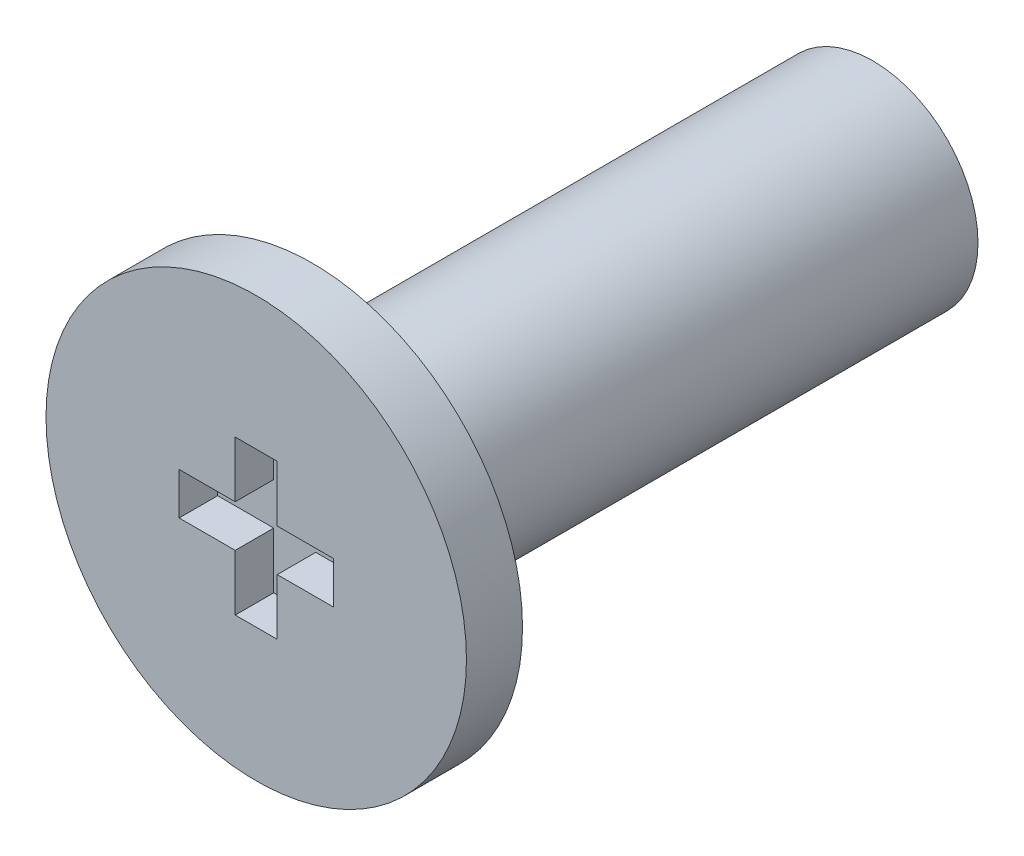
ISO-10303-21;
HEADER;
FILE_DESCRIPTION(('STEP AP214'),'2;1');
FILE_NAME('part.step','',(''),(''),'','','');
FILE_SCHEMA(('AUTOMOTIVE_DESIGN { 1 0 10303 214 1 1 1 1 }'));
ENDSEC;
DATA;
#1=APPLICATION_CONTEXT('core data for automotive mechanical design processes');
#2=APPLICATION_PROTOCOL_DEFINITION('international standard','automotive_design',2000,#1);
#3=PRODUCT_CONTEXT('',#1,'mechanical');
#4=PRODUCT('Part','Part','',(#3));
#5=PRODUCT_RELATED_PRODUCT_CATEGORY('part','',(#4));
#6=PRODUCT_DEFINITION_FORMATION('','',#4);
#7=PRODUCT_DEFINITION_CONTEXT('part definition',#1,'design');
#8=PRODUCT_DEFINITION('design','',#6,#7);
#9=PRODUCT_DEFINITION_SHAPE('','',#8);
#10=(LENGTH_UNIT() NAMED_UNIT(*) SI_UNIT(.MILLI.,.METRE.));
#11=(NAMED_UNIT(*) PLANE_ANGLE_UNIT() SI_UNIT($,.RADIAN.));
#12=(NAMED_UNIT(*) SI_UNIT($,.STERADIAN.) SOLID_ANGLE_UNIT());
#13=UNCERTAINTY_MEASURE_WITH_UNIT(LENGTH_MEASURE(1.E-05),#10,'distance_accuracy_value','');
#14=(GEOMETRIC_REPRESENTATION_CONTEXT(3) GLOBAL_UNCERTAINTY_ASSIGNED_CONTEXT((#13)) GLOBAL_UNIT_ASSIGNED_CONTEXT((#10,
#11,#12)) REPRESENTATION_CONTEXT('',''));
#15=CARTESIAN_POINT('',(0.,0.,0.));
#16=DIRECTION('',(0.,0.,1.));
#17=DIRECTION('',(1.,0.,0.));
#18=AXIS2_PLACEMENT_3D('',#15,#16,#17);
#19=CARTESIAN_POINT('',(0.,0.,-8.));
#20=DIRECTION('',(0.,0.,1.));
#21=DIRECTION('',(1.,0.,0.));
#22=AXIS2_PLACEMENT_3D('',#19,#20,#21);
#23=CYLINDRICAL_SURFACE('',#22,1.5);
#24=CARTESIAN_POINT('',(0.,0.,-8.));
#25=DIRECTION('',(0.,0.,1.));
#26=DIRECTION('',(1.,0.,0.));
#27=AXIS2_PLACEMENT_3D('',#24,#25,#26);
#28=CIRCLE('',#27,1.5);
#29=CARTESIAN_POINT('',(1.5,0.,-8.));
#30=VERTEX_POINT('',#29);
#31=EDGE_CURVE('E212',#30,#30,#28,.T.);
#32=ORIENTED_EDGE('',*,*,#31,.T.);
#33=EDGE_LOOP('',(#32));
#34=FACE_BOUND('',#33,.T.);
#35=CARTESIAN_POINT('',(0.,0.,0.));
#36=DIRECTION('',(0.,0.,1.));
#37=DIRECTION('',(1.,0.,0.));
#38=AXIS2_PLACEMENT_3D('',#35,#36,#37);
#39=CIRCLE('',#38,1.5);
#40=CARTESIAN_POINT('',(1.5,0.,0.));
#41=VERTEX_POINT('',#40);
#42=EDGE_CURVE('E208',#41,#41,#39,.T.);
#43=ORIENTED_EDGE('',*,*,#42,.F.);
#44=EDGE_LOOP('',(#43));
#45=FACE_BOUND('',#44,.T.);
#46=ADVANCED_FACE('F41',(#34,#45),#23,.T.);
#47=CARTESIAN_POINT('',(0.,0.,-8.));
#48=DIRECTION('',(0.,0.,1.));
#49=DIRECTION('',(1.,0.,0.));
#50=AXIS2_PLACEMENT_3D('',#47,#48,#49);
#51=PLANE('',#50);
#52=ORIENTED_EDGE('',*,*,#31,.F.);
#53=EDGE_LOOP('',(#52));
#54=FACE_BOUND('',#53,.T.);
#55=ADVANCED_FACE('F281',(#54),#51,.F.);
#56=CARTESIAN_POINT('',(0.,0.,0.));
#57=DIRECTION('',(0.,0.,1.));
#58=DIRECTION('',(1.,0.,0.));
#59=AXIS2_PLACEMENT_3D('',#56,#57,#58);
#60=PLANE('',#59);
#61=ORIENTED_EDGE('',*,*,#42,.T.);
#62=EDGE_LOOP('',(#61));
#63=FACE_BOUND('',#62,.T.);
#64=CARTESIAN_POINT('',(0.,0.,0.));
#65=DIRECTION('',(0.,0.,-1.));
#66=DIRECTION('',(-1.,0.,0.));
#67=AXIS2_PLACEMENT_3D('',#64,#65,#66);
#68=CIRCLE('',#67,3.);
#69=CARTESIAN_POINT('',(-3.,0.,0.));
#70=VERTEX_POINT('',#69);
#71=EDGE_CURVE('E210',#70,#70,#68,.T.);
#72=ORIENTED_EDGE('',*,*,#71,.T.);
#73=EDGE_LOOP('',(#72));
#74=FACE_BOUND('',#73,.T.);
#75=ADVANCED_FACE('F286',(#63,#74),#60,.F.);
#76=CARTESIAN_POINT('',(0.,0.,-2.));
#77=DIRECTION('',(0.,0.,-1.));
#78=DIRECTION('',(-1.,0.,0.));
#79=AXIS2_PLACEMENT_3D('',#76,#77,#78);
#80=CYLINDRICAL_SURFACE('',#79,3.);
#81=ORIENTED_EDGE('',*,*,#71,.F.);
#82=EDGE_LOOP('',(#81));
#83=FACE_BOUND('',#82,.T.);
#84=CARTESIAN_POINT('',(0.,0.,0.8));
#85=DIRECTION('',(0.,0.,-1.));
#86=DIRECTION('',(-1.,0.,0.));
#87=AXIS2_PLACEMENT_3D('',#84,#85,#86);
#88=CIRCLE('',#87,3.);
#89=CARTESIAN_POINT('',(-3.,0.,0.8));
#90=VERTEX_POINT('',#89);
#91=EDGE_CURVE('E180',#90,#90,#88,.T.);
#92=ORIENTED_EDGE('',*,*,#91,.T.);
#93=EDGE_LOOP('',(#92));
#94=FACE_BOUND('',#93,.T.);
#95=ADVANCED_FACE('F300',(#83,#94),#80,.T.);
#96=CARTESIAN_POINT('',(3.,0.,0.8));
#97=DIRECTION('',(0.,0.,-1.));
#98=DIRECTION('',(-1.,0.,0.));
#99=AXIS2_PLACEMENT_3D('',#96,#97,#98);
#100=PLANE('',#99);
#101=DIRECTION('',(-1.,0.,0.));
#102=VECTOR('',#101,1.);
#103=CARTESIAN_POINT('',(3.,-1.1,0.8));
#104=LINE('',#103,#102);
#105=CARTESIAN_POINT('',(0.3,-1.1,0.8));
#106=VERTEX_POINT('',#105);
#107=CARTESIAN_POINT('',(-0.3,-1.1,0.8));
#108=VERTEX_POINT('',#107);
#109=EDGE_CURVE('E211',#106,#108,#104,.T.);
#110=ORIENTED_EDGE('',*,*,#109,.T.);
#111=DIRECTION('',(0.,1.,0.));
#112=VECTOR('',#111,1.);
#113=CARTESIAN_POINT('',(-0.3,0.,0.8));
#114=LINE('',#113,#112);
#115=CARTESIAN_POINT('',(-0.3,-0.3,0.8));
#116=VERTEX_POINT('',#115);
#117=EDGE_CURVE('E11',#108,#116,#114,.T.);
#118=ORIENTED_EDGE('',*,*,#117,.T.);
#119=DIRECTION('',(-1.,0.,0.));
#120=VECTOR('',#119,1.);
#121=CARTESIAN_POINT('',(3.,-0.3,0.8));
#122=LINE('',#121,#120);
#123=CARTESIAN_POINT('',(-1.1,-0.3,0.8));
#124=VERTEX_POINT('',#123);
#125=EDGE_CURVE('E48',#116,#124,#122,.T.);
#126=ORIENTED_EDGE('',*,*,#125,.T.);
#127=DIRECTION('',(0.,1.,0.));
#128=VECTOR('',#127,1.);
#129=CARTESIAN_POINT('',(-1.1,0.,0.8));
#130=LINE('',#129,#128);
#131=CARTESIAN_POINT('',(-1.1,0.3,0.8));
#132=VERTEX_POINT('',#131);
#133=EDGE_CURVE('E245',#124,#132,#130,.T.);
#134=ORIENTED_EDGE('',*,*,#133,.T.);
#135=DIRECTION('',(1.,0.,0.));
#136=VECTOR('',#135,1.);
#137=CARTESIAN_POINT('',(3.,0.3,0.8));
#138=LINE('',#137,#136);
#139=CARTESIAN_POINT('',(-0.3,0.3,0.8));
#140=VERTEX_POINT('',#139);
#141=EDGE_CURVE('E236',#132,#140,#138,.T.);
#142=ORIENTED_EDGE('',*,*,#141,.T.);
#143=DIRECTION('',(0.,1.,0.));
#144=VECTOR('',#143,1.);
#145=CARTESIAN_POINT('',(-0.3,0.,0.8));
#146=LINE('',#145,#144);
#147=CARTESIAN_POINT('',(-0.3,1.1,0.8));
#148=VERTEX_POINT('',#147);
#149=EDGE_CURVE('E237',#140,#148,#146,.T.);
#150=ORIENTED_EDGE('',*,*,#149,.T.);
#151=DIRECTION('',(1.,0.,0.));
#152=VECTOR('',#151,1.);
#153=CARTESIAN_POINT('',(3.,1.1,0.8));
#154=LINE('',#153,#152);
#155=CARTESIAN_POINT('',(0.3,1.1,0.8));
#156=VERTEX_POINT('',#155);
#157=EDGE_CURVE('E231',#148,#156,#154,.T.);
#158=ORIENTED_EDGE('',*,*,#157,.T.);
#159=DIRECTION('',(0.,-1.,0.));
#160=VECTOR('',#159,1.);
#161=CARTESIAN_POINT('',(0.3,0.,0.8));
#162=LINE('',#161,#160);
#163=CARTESIAN_POINT('',(0.3,0.3,0.8));
#164=VERTEX_POINT('',#163);
#165=EDGE_CURVE('E229',#156,#164,#162,.T.);
#166=ORIENTED_EDGE('',*,*,#165,.T.);
#167=DIRECTION('',(1.,0.,0.));
#168=VECTOR('',#167,1.);
#169=CARTESIAN_POINT('',(3.,0.3,0.8));
#170=LINE('',#169,#168);
#171=CARTESIAN_POINT('',(1.1,0.3,0.8));
#172=VERTEX_POINT('',#171);
#173=EDGE_CURVE('E230',#164,#172,#170,.T.);
#174=ORIENTED_EDGE('',*,*,#173,.T.);
#175=DIRECTION('',(0.,-1.,0.));
#176=VECTOR('',#175,1.);
#177=CARTESIAN_POINT('',(1.1,0.,0.8));
#178=LINE('',#177,#176);
#179=CARTESIAN_POINT('',(1.1,-0.3,0.8));
#180=VERTEX_POINT('',#179);
#181=EDGE_CURVE('E224',#172,#180,#178,.T.);
#182=ORIENTED_EDGE('',*,*,#181,.T.);
#183=DIRECTION('',(-1.,0.,0.));
#184=VECTOR('',#183,1.);
#185=CARTESIAN_POINT('',(3.,-0.3,0.8));
#186=LINE('',#185,#184);
#187=CARTESIAN_POINT('',(0.3,-0.3,0.8));
#188=VERTEX_POINT('',#187);
#189=EDGE_CURVE('E222',#180,#188,#186,.T.);
#190=ORIENTED_EDGE('',*,*,#189,.T.);
#191=DIRECTION('',(0.,-1.,0.));
#192=VECTOR('',#191,1.);
#193=CARTESIAN_POINT('',(0.3,0.,0.8));
#194=LINE('',#193,#192);
#195=EDGE_CURVE('E217',#188,#106,#194,.T.);
#196=ORIENTED_EDGE('',*,*,#195,.T.);
#197=EDGE_LOOP('',(#110,#118,#126,#134,#142,#150,#158,#166,#174,#182,#190,#196));
#198=FACE_BOUND('',#197,.T.);
#199=ORIENTED_EDGE('',*,*,#91,.F.);
#200=EDGE_LOOP('',(#199));
#201=FACE_BOUND('',#200,.T.);
#202=ADVANCED_FACE('F244',(#198,#201),#100,.F.);
#203=CARTESIAN_POINT('',(-0.3,-0.3,0.25));
#204=DIRECTION('',(-1.,0.,0.));
#205=DIRECTION('',(0.,0.,1.));
#206=AXIS2_PLACEMENT_3D('',#203,#204,#205);
#207=PLANE('',#206);
#208=DIRECTION('',(0.,0.,1.));
#209=VECTOR('',#208,1.);
#210=CARTESIAN_POINT('',(-0.3,-1.1,0.25));
#211=LINE('',#210,#209);
#212=CARTESIAN_POINT('',(-0.3,-1.1,0.25));
#213=VERTEX_POINT('',#212);
#214=EDGE_CURVE('E54',#213,#108,#211,.T.);
#215=ORIENTED_EDGE('',*,*,#214,.F.);
#216=DIRECTION('',(0.,-1.,0.));
#217=VECTOR('',#216,1.);
#218=CARTESIAN_POINT('',(-0.3,-0.3,0.25));
#219=LINE('',#218,#217);
#220=CARTESIAN_POINT('',(-0.3,-0.3,0.25));
#221=VERTEX_POINT('',#220);
#222=EDGE_CURVE('E129',#221,#213,#219,.T.);
#223=ORIENTED_EDGE('',*,*,#222,.F.);
#224=DIRECTION('',(0.,0.,1.));
#225=VECTOR('',#224,1.);
#226=CARTESIAN_POINT('',(-0.3,-0.3,0.25));
#227=LINE('',#226,#225);
#228=EDGE_CURVE('E171',#221,#116,#227,.T.);
#229=ORIENTED_EDGE('',*,*,#228,.T.);
#230=ORIENTED_EDGE('',*,*,#117,.F.);
#231=EDGE_LOOP('',(#215,#223,#229,#230));
#232=FACE_BOUND('',#231,.T.);
#233=ADVANCED_FACE('F127',(#232),#207,.F.);
#234=CARTESIAN_POINT('',(-1.1,-0.3,0.25));
#235=DIRECTION('',(0.,-1.,0.));
#236=DIRECTION('',(0.,0.,-1.));
#237=AXIS2_PLACEMENT_3D('',#234,#235,#236);
#238=PLANE('',#237);
#239=ORIENTED_EDGE('',*,*,#228,.F.);
#240=DIRECTION('',(1.,0.,0.));
#241=VECTOR('',#240,1.);
#242=CARTESIAN_POINT('',(-1.1,-0.3,0.25));
#243=LINE('',#242,#241);
#244=CARTESIAN_POINT('',(-1.1,-0.3,0.25));
#245=VERTEX_POINT('',#244);
#246=EDGE_CURVE('E131',#245,#221,#243,.T.);
#247=ORIENTED_EDGE('',*,*,#246,.F.);
#248=DIRECTION('',(0.,0.,1.));
#249=VECTOR('',#248,1.);
#250=CARTESIAN_POINT('',(-1.1,-0.3,0.25));
#251=LINE('',#250,#249);
#252=EDGE_CURVE('E177',#245,#124,#251,.T.);
#253=ORIENTED_EDGE('',*,*,#252,.T.);
#254=ORIENTED_EDGE('',*,*,#125,.F.);
#255=EDGE_LOOP('',(#239,#247,#253,#254));
#256=FACE_BOUND('',#255,.T.);
#257=ADVANCED_FACE('F273',(#256),#238,.F.);
#258=CARTESIAN_POINT('',(-1.1,0.3,0.25));
#259=DIRECTION('',(-1.,0.,0.));
#260=DIRECTION('',(0.,0.,1.));
#261=AXIS2_PLACEMENT_3D('',#258,#259,#260);
#262=PLANE('',#261);
#263=ORIENTED_EDGE('',*,*,#252,.F.);
#264=DIRECTION('',(0.,-1.,0.));
#265=VECTOR('',#264,1.);
#266=CARTESIAN_POINT('',(-1.1,0.3,0.25));
#267=LINE('',#266,#265);
#268=CARTESIAN_POINT('',(-1.1,0.3,0.25));
#269=VERTEX_POINT('',#268);
#270=EDGE_CURVE('E175',#269,#245,#267,.T.);
#271=ORIENTED_EDGE('',*,*,#270,.F.);
#272=DIRECTION('',(0.,0.,1.));
#273=VECTOR('',#272,1.);
#274=CARTESIAN_POINT('',(-1.1,0.3,0.25));
#275=LINE('',#274,#273);
#276=EDGE_CURVE('E179',#269,#132,#275,.T.);
#277=ORIENTED_EDGE('',*,*,#276,.T.);
#278=ORIENTED_EDGE('',*,*,#133,.F.);
#279=EDGE_LOOP('',(#263,#271,#277,#278));
#280=FACE_BOUND('',#279,.T.);
#281=ADVANCED_FACE('F275',(#280),#262,.F.);
#282=CARTESIAN_POINT('',(-0.3,0.3,0.25));
#283=DIRECTION('',(0.,1.,0.));
#284=DIRECTION('',(0.,0.,1.));
#285=AXIS2_PLACEMENT_3D('',#282,#283,#284);
#286=PLANE('',#285);
#287=ORIENTED_EDGE('',*,*,#276,.F.);
#288=DIRECTION('',(-1.,0.,0.));
#289=VECTOR('',#288,1.);
#290=CARTESIAN_POINT('',(-0.3,0.3,0.25));
#291=LINE('',#290,#289);
#292=CARTESIAN_POINT('',(-0.3,0.3,0.25));
#293=VERTEX_POINT('',#292);
#294=EDGE_CURVE('E168',#293,#269,#291,.T.);
#295=ORIENTED_EDGE('',*,*,#294,.F.);
#296=DIRECTION('',(0.,0.,1.));
#297=VECTOR('',#296,1.);
#298=CARTESIAN_POINT('',(-0.3,0.3,0.25));
#299=LINE('',#298,#297);
#300=EDGE_CURVE('E181',#293,#140,#299,.T.);
#301=ORIENTED_EDGE('',*,*,#300,.T.);
#302=ORIENTED_EDGE('',*,*,#141,.F.);
#303=EDGE_LOOP('',(#287,#295,#301,#302));
#304=FACE_BOUND('',#303,.T.);
#305=ADVANCED_FACE('F269',(#304),#286,.F.);
#306=CARTESIAN_POINT('',(-0.3,1.1,0.25));
#307=DIRECTION('',(-1.,0.,0.));
#308=DIRECTION('',(0.,0.,1.));
#309=AXIS2_PLACEMENT_3D('',#306,#307,#308);
#310=PLANE('',#309);
#311=ORIENTED_EDGE('',*,*,#300,.F.);
#312=DIRECTION('',(0.,-1.,0.));
#313=VECTOR('',#312,1.);
#314=CARTESIAN_POINT('',(-0.3,1.1,0.25));
#315=LINE('',#314,#313);
#316=CARTESIAN_POINT('',(-0.3,1.1,0.25));
#317=VERTEX_POINT('',#316);
#318=EDGE_CURVE('E166',#317,#293,#315,.T.);
#319=ORIENTED_EDGE('',*,*,#318,.F.);
#320=DIRECTION('',(0.,0.,1.));
#321=VECTOR('',#320,1.);
#322=CARTESIAN_POINT('',(-0.3,1.1,0.25));
#323=LINE('',#322,#321);
#324=EDGE_CURVE('E188',#317,#148,#323,.T.);
#325=ORIENTED_EDGE('',*,*,#324,.T.);
#326=ORIENTED_EDGE('',*,*,#149,.F.);
#327=EDGE_LOOP('',(#311,#319,#325,#326));
#328=FACE_BOUND('',#327,.T.);
#329=ADVANCED_FACE('F266',(#328),#310,.F.);
#330=CARTESIAN_POINT('',(0.3,1.1,0.25));
#331=DIRECTION('',(0.,1.,0.));
#332=DIRECTION('',(0.,0.,1.));
#333=AXIS2_PLACEMENT_3D('',#330,#331,#332);
#334=PLANE('',#333);
#335=ORIENTED_EDGE('',*,*,#324,.F.);
#336=DIRECTION('',(-1.,0.,0.));
#337=VECTOR('',#336,1.);
#338=CARTESIAN_POINT('',(0.3,1.1,0.25));
#339=LINE('',#338,#337);
#340=CARTESIAN_POINT('',(0.3,1.1,0.25));
#341=VERTEX_POINT('',#340);
#342=EDGE_CURVE('E164',#341,#317,#339,.T.);
#343=ORIENTED_EDGE('',*,*,#342,.F.);
#344=DIRECTION('',(0.,0.,1.));
#345=VECTOR('',#344,1.);
#346=CARTESIAN_POINT('',(0.3,1.1,0.25));
#347=LINE('',#346,#345);
#348=EDGE_CURVE('E189',#341,#156,#347,.T.);
#349=ORIENTED_EDGE('',*,*,#348,.T.);
#350=ORIENTED_EDGE('',*,*,#157,.F.);
#351=EDGE_LOOP('',(#335,#343,#349,#350));
#352=FACE_BOUND('',#351,.T.);
#353=ADVANCED_FACE('F261',(#352),#334,.F.);
#354=CARTESIAN_POINT('',(0.3,0.3,0.25));
#355=DIRECTION('',(1.,0.,0.));
#356=DIRECTION('',(0.,0.,-1.));
#357=AXIS2_PLACEMENT_3D('',#354,#355,#356);
#358=PLANE('',#357);
#359=ORIENTED_EDGE('',*,*,#348,.F.);
#360=DIRECTION('',(0.,1.,0.));
#361=VECTOR('',#360,1.);
#362=CARTESIAN_POINT('',(0.3,0.3,0.25));
#363=LINE('',#362,#361);
#364=CARTESIAN_POINT('',(0.3,0.3,0.25));
#365=VERTEX_POINT('',#364);
#366=EDGE_CURVE('E158',#365,#341,#363,.T.);
#367=ORIENTED_EDGE('',*,*,#366,.F.);
#368=DIRECTION('',(0.,0.,1.));
#369=VECTOR('',#368,1.);
#370=CARTESIAN_POINT('',(0.3,0.3,0.25));
#371=LINE('',#370,#369);
#372=EDGE_CURVE('E195',#365,#164,#371,.T.);
#373=ORIENTED_EDGE('',*,*,#372,.T.);
#374=ORIENTED_EDGE('',*,*,#165,.F.);
#375=EDGE_LOOP('',(#359,#367,#373,#374));
#376=FACE_BOUND('',#375,.T.);
#377=ADVANCED_FACE('F263',(#376),#358,.F.);
#378=CARTESIAN_POINT('',(1.1,0.3,0.25));
#379=DIRECTION('',(0.,1.,0.));
#380=DIRECTION('',(0.,0.,1.));
#381=AXIS2_PLACEMENT_3D('',#378,#379,#380);
#382=PLANE('',#381);
#383=ORIENTED_EDGE('',*,*,#372,.F.);
#384=DIRECTION('',(-1.,0.,0.));
#385=VECTOR('',#384,1.);
#386=CARTESIAN_POINT('',(1.1,0.3,0.25));
#387=LINE('',#386,#385);
#388=CARTESIAN_POINT('',(1.1,0.3,0.25));
#389=VERTEX_POINT('',#388);
#390=EDGE_CURVE('E160',#389,#365,#387,.T.);
#391=ORIENTED_EDGE('',*,*,#390,.F.);
#392=DIRECTION('',(0.,0.,1.));
#393=VECTOR('',#392,1.);
#394=CARTESIAN_POINT('',(1.1,0.3,0.25));
#395=LINE('',#394,#393);
#396=EDGE_CURVE('E194',#389,#172,#395,.T.);
#397=ORIENTED_EDGE('',*,*,#396,.T.);
#398=ORIENTED_EDGE('',*,*,#173,.F.);
#399=EDGE_LOOP('',(#383,#391,#397,#398));
#400=FACE_BOUND('',#399,.T.);
#401=ADVANCED_FACE('F257',(#400),#382,.F.);
#402=CARTESIAN_POINT('',(1.1,-0.3,0.25));
#403=DIRECTION('',(1.,0.,0.));
#404=DIRECTION('',(0.,0.,-1.));
#405=AXIS2_PLACEMENT_3D('',#402,#403,#404);
#406=PLANE('',#405);
#407=ORIENTED_EDGE('',*,*,#396,.F.);
#408=DIRECTION('',(0.,1.,0.));
#409=VECTOR('',#408,1.);
#410=CARTESIAN_POINT('',(1.1,-0.3,0.25));
#411=LINE('',#410,#409);
#412=CARTESIAN_POINT('',(1.1,-0.3,0.25));
#413=VERTEX_POINT('',#412);
#414=EDGE_CURVE('E153',#413,#389,#411,.T.);
#415=ORIENTED_EDGE('',*,*,#414,.F.);
#416=DIRECTION('',(0.,0.,1.));
#417=VECTOR('',#416,1.);
#418=CARTESIAN_POINT('',(1.1,-0.3,0.25));
#419=LINE('',#418,#417);
#420=EDGE_CURVE('E198',#413,#180,#419,.T.);
#421=ORIENTED_EDGE('',*,*,#420,.T.);
#422=ORIENTED_EDGE('',*,*,#181,.F.);
#423=EDGE_LOOP('',(#407,#415,#421,#422));
#424=FACE_BOUND('',#423,.T.);
#425=ADVANCED_FACE('F253',(#424),#406,.F.);
#426=CARTESIAN_POINT('',(0.3,-0.3,0.25));
#427=DIRECTION('',(0.,-1.,0.));
#428=DIRECTION('',(0.,0.,-1.));
#429=AXIS2_PLACEMENT_3D('',#426,#427,#428);
#430=PLANE('',#429);
#431=ORIENTED_EDGE('',*,*,#420,.F.);
#432=DIRECTION('',(1.,0.,0.));
#433=VECTOR('',#432,1.);
#434=CARTESIAN_POINT('',(0.3,-0.3,0.25));
#435=LINE('',#434,#433);
#436=CARTESIAN_POINT('',(0.3,-0.3,0.25));
#437=VERTEX_POINT('',#436);
#438=EDGE_CURVE('E151',#437,#413,#435,.T.);
#439=ORIENTED_EDGE('',*,*,#438,.F.);
#440=DIRECTION('',(0.,0.,1.));
#441=VECTOR('',#440,1.);
#442=CARTESIAN_POINT('',(0.3,-0.3,0.25));
#443=LINE('',#442,#441);
#444=EDGE_CURVE('E201',#437,#188,#443,.T.);
#445=ORIENTED_EDGE('',*,*,#444,.T.);
#446=ORIENTED_EDGE('',*,*,#189,.F.);
#447=EDGE_LOOP('',(#431,#439,#445,#446));
#448=FACE_BOUND('',#447,.T.);
#449=ADVANCED_FACE('F255',(#448),#430,.F.);
#450=CARTESIAN_POINT('',(0.3,-1.1,0.25));
#451=DIRECTION('',(1.,0.,0.));
#452=DIRECTION('',(0.,0.,-1.));
#453=AXIS2_PLACEMENT_3D('',#450,#451,#452);
#454=PLANE('',#453);
#455=ORIENTED_EDGE('',*,*,#444,.F.);
#456=DIRECTION('',(0.,1.,0.));
#457=VECTOR('',#456,1.);
#458=CARTESIAN_POINT('',(0.3,-1.1,0.25));
#459=LINE('',#458,#457);
#460=CARTESIAN_POINT('',(0.3,-1.1,0.25));
#461=VERTEX_POINT('',#460);
#462=EDGE_CURVE('E142',#461,#437,#459,.T.);
#463=ORIENTED_EDGE('',*,*,#462,.F.);
#464=DIRECTION('',(0.,0.,1.));
#465=VECTOR('',#464,1.);
#466=CARTESIAN_POINT('',(0.3,-1.1,0.25));
#467=LINE('',#466,#465);
#468=EDGE_CURVE('E134',#461,#106,#467,.T.);
#469=ORIENTED_EDGE('',*,*,#468,.T.);
#470=ORIENTED_EDGE('',*,*,#195,.F.);
#471=EDGE_LOOP('',(#455,#463,#469,#470));
#472=FACE_BOUND('',#471,.T.);
#473=ADVANCED_FACE('F248',(#472),#454,.F.);
#474=CARTESIAN_POINT('',(-0.3,-1.1,0.25));
#475=DIRECTION('',(0.,-1.,0.));
#476=DIRECTION('',(0.,0.,-1.));
#477=AXIS2_PLACEMENT_3D('',#474,#475,#476);
#478=PLANE('',#477);
#479=ORIENTED_EDGE('',*,*,#468,.F.);
#480=DIRECTION('',(1.,0.,0.));
#481=VECTOR('',#480,1.);
#482=CARTESIAN_POINT('',(-0.3,-1.1,0.25));
#483=LINE('',#482,#481);
#484=EDGE_CURVE('E140',#213,#461,#483,.T.);
#485=ORIENTED_EDGE('',*,*,#484,.F.);
#486=ORIENTED_EDGE('',*,*,#214,.T.);
#487=ORIENTED_EDGE('',*,*,#109,.F.);
#488=EDGE_LOOP('',(#479,#485,#486,#487));
#489=FACE_BOUND('',#488,.T.);
#490=ADVANCED_FACE('F139',(#489),#478,.F.);
#491=CARTESIAN_POINT('',(0.,0.,0.25));
#492=DIRECTION('',(0.,0.,1.));
#493=DIRECTION('',(1.,0.,0.));
#494=AXIS2_PLACEMENT_3D('',#491,#492,#493);
#495=PLANE('',#494);
#496=ORIENTED_EDGE('',*,*,#222,.T.);
#497=ORIENTED_EDGE('',*,*,#484,.T.);
#498=ORIENTED_EDGE('',*,*,#462,.T.);
#499=ORIENTED_EDGE('',*,*,#438,.T.);
#500=ORIENTED_EDGE('',*,*,#414,.T.);
#501=ORIENTED_EDGE('',*,*,#390,.T.);
#502=ORIENTED_EDGE('',*,*,#366,.T.);
#503=ORIENTED_EDGE('',*,*,#342,.T.);
#504=ORIENTED_EDGE('',*,*,#318,.T.);
#505=ORIENTED_EDGE('',*,*,#294,.T.);
#506=ORIENTED_EDGE('',*,*,#270,.T.);
#507=ORIENTED_EDGE('',*,*,#246,.T.);
#508=EDGE_LOOP('',(#496,#497,#498,#499,#500,#501,#502,#503,#504,#505,#506,#507));
#509=FACE_BOUND('',#508,.T.);
#510=ADVANCED_FACE('F144',(#509),#495,.T.);
#511=CLOSED_SHELL('',(#46,#55,#75,#95,#202,#233,#257,#281,#305,#329,#353,#377,#401,#425,#449,
#473,#490,#510));
#512=MANIFOLD_SOLID_BREP('B2',#511);
#513=ADVANCED_BREP_SHAPE_REPRESENTATION('',(#18,#512),#14);
#514=SHAPE_DEFINITION_REPRESENTATION(#9,#513);
ENDSEC;
END-ISO-10303-21;
